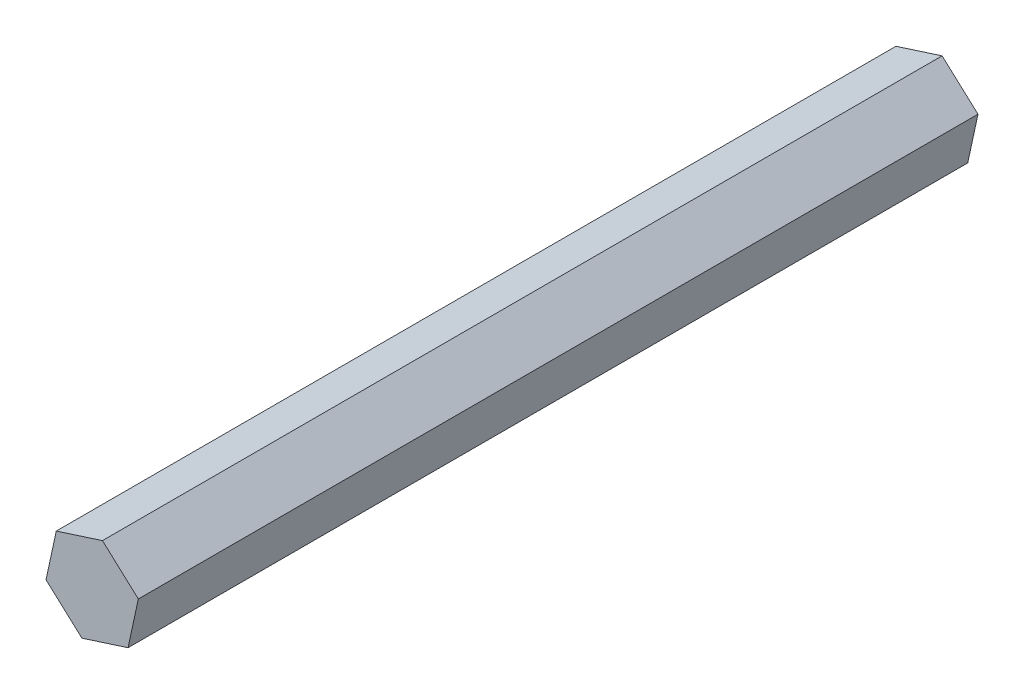
ISO-10303-21;
HEADER;
FILE_DESCRIPTION(('STEP AP214'),'2;1');
FILE_NAME('part.step','',(''),(''),'','','');
FILE_SCHEMA(('AUTOMOTIVE_DESIGN { 1 0 10303 214 1 1 1 1 }'));
ENDSEC;
DATA;
#1=APPLICATION_CONTEXT('core data for automotive mechanical design processes');
#2=APPLICATION_PROTOCOL_DEFINITION('international standard','automotive_design',2000,#1);
#3=PRODUCT_CONTEXT('',#1,'mechanical');
#4=PRODUCT('Part','Part','',(#3));
#5=PRODUCT_RELATED_PRODUCT_CATEGORY('part','',(#4));
#6=PRODUCT_DEFINITION_FORMATION('','',#4);
#7=PRODUCT_DEFINITION_CONTEXT('part definition',#1,'design');
#8=PRODUCT_DEFINITION('design','',#6,#7);
#9=PRODUCT_DEFINITION_SHAPE('','',#8);
#10=(LENGTH_UNIT() NAMED_UNIT(*) SI_UNIT(.MILLI.,.METRE.));
#11=(NAMED_UNIT(*) PLANE_ANGLE_UNIT() SI_UNIT($,.RADIAN.));
#12=(NAMED_UNIT(*) SI_UNIT($,.STERADIAN.) SOLID_ANGLE_UNIT());
#13=UNCERTAINTY_MEASURE_WITH_UNIT(LENGTH_MEASURE(1.E-05),#10,'distance_accuracy_value','');
#14=(GEOMETRIC_REPRESENTATION_CONTEXT(3) GLOBAL_UNCERTAINTY_ASSIGNED_CONTEXT((#13)) GLOBAL_UNIT_ASSIGNED_CONTEXT((#10,
#11,#12)) REPRESENTATION_CONTEXT('',''));
#15=CARTESIAN_POINT('',(0.,0.,0.));
#16=DIRECTION('',(0.,0.,1.));
#17=DIRECTION('',(1.,0.,0.));
#18=AXIS2_PLACEMENT_3D('',#15,#16,#17);
#19=CARTESIAN_POINT('',(-0.61182187926995,-2.82117126764399,50.));
#20=DIRECTION('',(-0.305094633460301,0.952322038300976,0.));
#21=DIRECTION('',(-0.952322038300976,-0.305094633460301,0.));
#22=AXIS2_PLACEMENT_3D('',#19,#20,#21);
#23=PLANE('',#22);
#24=DIRECTION('',(0.952322038300976,0.305094633460301,0.));
#25=VECTOR('',#24,1.);
#26=CARTESIAN_POINT('',(-0.61182187926995,-2.82117126764399,0.));
#27=LINE('',#26,#25);
#28=CARTESIAN_POINT('',(-0.61182187926995,-2.82117126764399,0.));
#29=VERTEX_POINT('',#28);
#30=CARTESIAN_POINT('',(2.13729504657146,-1.94043892386091,0.));
#31=VERTEX_POINT('',#30);
#32=EDGE_CURVE('E128',#29,#31,#27,.T.);
#33=ORIENTED_EDGE('',*,*,#32,.T.);
#34=DIRECTION('',(0.,0.,-1.));
#35=VECTOR('',#34,1.);
#36=CARTESIAN_POINT('',(2.13729504657146,-1.94043892386091,50.));
#37=LINE('',#36,#35);
#38=CARTESIAN_POINT('',(2.13729504657146,-1.94043892386091,50.));
#39=VERTEX_POINT('',#38);
#40=EDGE_CURVE('E11',#39,#31,#37,.T.);
#41=ORIENTED_EDGE('',*,*,#40,.F.);
#42=DIRECTION('',(0.952322038300976,0.305094633460301,0.));
#43=VECTOR('',#42,1.);
#44=CARTESIAN_POINT('',(-0.61182187926995,-2.82117126764399,50.));
#45=LINE('',#44,#43);
#46=CARTESIAN_POINT('',(-0.61182187926995,-2.82117126764399,50.));
#47=VERTEX_POINT('',#46);
#48=EDGE_CURVE('E144',#47,#39,#45,.T.);
#49=ORIENTED_EDGE('',*,*,#48,.F.);
#50=DIRECTION('',(0.,0.,-1.));
#51=VECTOR('',#50,1.);
#52=CARTESIAN_POINT('',(-0.61182187926995,-2.82117126764399,50.));
#53=LINE('',#52,#51);
#54=EDGE_CURVE('E124',#47,#29,#53,.T.);
#55=ORIENTED_EDGE('',*,*,#54,.T.);
#56=EDGE_LOOP('',(#33,#41,#49,#55));
#57=FACE_BOUND('',#56,.T.);
#58=ADVANCED_FACE('F39',(#57),#23,.F.);
#59=CARTESIAN_POINT('',(2.13729504657146,-1.94043892386091,50.));
#60=DIRECTION('',(-0.977282394482572,0.211941316015566,0.));
#61=DIRECTION('',(-0.211941316015566,-0.977282394482572,0.));
#62=AXIS2_PLACEMENT_3D('',#59,#60,#61);
#63=PLANE('',#62);
#64=DIRECTION('',(0.211941316015566,0.977282394482572,0.));
#65=VECTOR('',#64,1.);
#66=CARTESIAN_POINT('',(2.13729504657146,-1.94043892386091,0.));
#67=LINE('',#66,#65);
#68=CARTESIAN_POINT('',(2.74911692584142,0.880732343783076,0.));
#69=VERTEX_POINT('',#68);
#70=EDGE_CURVE('E132',#31,#69,#67,.T.);
#71=ORIENTED_EDGE('',*,*,#70,.T.);
#72=DIRECTION('',(0.,0.,-1.));
#73=VECTOR('',#72,1.);
#74=CARTESIAN_POINT('',(2.74911692584142,0.880732343783076,50.));
#75=LINE('',#74,#73);
#76=CARTESIAN_POINT('',(2.74911692584142,0.880732343783076,50.));
#77=VERTEX_POINT('',#76);
#78=EDGE_CURVE('E48',#77,#69,#75,.T.);
#79=ORIENTED_EDGE('',*,*,#78,.F.);
#80=DIRECTION('',(0.211941316015566,0.977282394482572,0.));
#81=VECTOR('',#80,1.);
#82=CARTESIAN_POINT('',(2.13729504657146,-1.94043892386091,50.));
#83=LINE('',#82,#81);
#84=EDGE_CURVE('E93',#39,#77,#83,.T.);
#85=ORIENTED_EDGE('',*,*,#84,.F.);
#86=ORIENTED_EDGE('',*,*,#40,.T.);
#87=EDGE_LOOP('',(#71,#79,#85,#86));
#88=FACE_BOUND('',#87,.T.);
#89=ADVANCED_FACE('F172',(#88),#63,.F.);
#90=CARTESIAN_POINT('',(2.74911692584142,0.880732343783076,50.));
#91=DIRECTION('',(-0.672187761022271,-0.74038072228541,0.));
#92=DIRECTION('',(0.74038072228541,-0.672187761022271,0.));
#93=AXIS2_PLACEMENT_3D('',#90,#91,#92);
#94=PLANE('',#93);
#95=DIRECTION('',(-0.74038072228541,0.672187761022271,0.));
#96=VECTOR('',#95,1.);
#97=CARTESIAN_POINT('',(2.74911692584142,0.880732343783076,0.));
#98=LINE('',#97,#96);
#99=CARTESIAN_POINT('',(0.611821879269952,2.82117126764399,0.));
#100=VERTEX_POINT('',#99);
#101=EDGE_CURVE('E135',#69,#100,#98,.T.);
#102=ORIENTED_EDGE('',*,*,#101,.T.);
#103=DIRECTION('',(0.,0.,-1.));
#104=VECTOR('',#103,1.);
#105=CARTESIAN_POINT('',(0.611821879269952,2.82117126764399,50.));
#106=LINE('',#105,#104);
#107=CARTESIAN_POINT('',(0.611821879269952,2.82117126764399,50.));
#108=VERTEX_POINT('',#107);
#109=EDGE_CURVE('E117',#108,#100,#106,.T.);
#110=ORIENTED_EDGE('',*,*,#109,.F.);
#111=DIRECTION('',(-0.74038072228541,0.672187761022271,0.));
#112=VECTOR('',#111,1.);
#113=CARTESIAN_POINT('',(2.74911692584142,0.880732343783076,50.));
#114=LINE('',#113,#112);
#115=EDGE_CURVE('E106',#77,#108,#114,.T.);
#116=ORIENTED_EDGE('',*,*,#115,.F.);
#117=ORIENTED_EDGE('',*,*,#78,.T.);
#118=EDGE_LOOP('',(#102,#110,#116,#117));
#119=FACE_BOUND('',#118,.T.);
#120=ADVANCED_FACE('F154',(#119),#94,.F.);
#121=CARTESIAN_POINT('',(0.611821879269952,2.82117126764399,50.));
#122=DIRECTION('',(0.305094633460301,-0.952322038300976,0.));
#123=DIRECTION('',(0.952322038300976,0.305094633460301,0.));
#124=AXIS2_PLACEMENT_3D('',#121,#122,#123);
#125=PLANE('',#124);
#126=DIRECTION('',(-0.952322038300976,-0.305094633460301,0.));
#127=VECTOR('',#126,1.);
#128=CARTESIAN_POINT('',(0.611821879269952,2.82117126764399,0.));
#129=LINE('',#128,#127);
#130=CARTESIAN_POINT('',(-2.13729504657146,1.94043892386091,0.));
#131=VERTEX_POINT('',#130);
#132=EDGE_CURVE('E115',#100,#131,#129,.T.);
#133=ORIENTED_EDGE('',*,*,#132,.T.);
#134=DIRECTION('',(0.,0.,-1.));
#135=VECTOR('',#134,1.);
#136=CARTESIAN_POINT('',(-2.13729504657146,1.94043892386091,50.));
#137=LINE('',#136,#135);
#138=CARTESIAN_POINT('',(-2.13729504657146,1.94043892386091,50.));
#139=VERTEX_POINT('',#138);
#140=EDGE_CURVE('E112',#139,#131,#137,.T.);
#141=ORIENTED_EDGE('',*,*,#140,.F.);
#142=DIRECTION('',(-0.952322038300976,-0.305094633460301,0.));
#143=VECTOR('',#142,1.);
#144=CARTESIAN_POINT('',(0.611821879269952,2.82117126764399,50.));
#145=LINE('',#144,#143);
#146=EDGE_CURVE('E100',#108,#139,#145,.T.);
#147=ORIENTED_EDGE('',*,*,#146,.F.);
#148=ORIENTED_EDGE('',*,*,#109,.T.);
#149=EDGE_LOOP('',(#133,#141,#147,#148));
#150=FACE_BOUND('',#149,.T.);
#151=ADVANCED_FACE('F113',(#150),#125,.F.);
#152=CARTESIAN_POINT('',(-2.13729504657146,1.94043892386091,50.));
#153=DIRECTION('',(0.977282394482573,-0.211941316015565,0.));
#154=DIRECTION('',(0.211941316015565,0.977282394482573,0.));
#155=AXIS2_PLACEMENT_3D('',#152,#153,#154);
#156=PLANE('',#155);
#157=DIRECTION('',(-0.211941316015565,-0.977282394482572,0.));
#158=VECTOR('',#157,1.);
#159=CARTESIAN_POINT('',(-2.13729504657146,1.94043892386091,0.));
#160=LINE('',#159,#158);
#161=CARTESIAN_POINT('',(-2.74911692584141,-0.88073234378308,0.));
#162=VERTEX_POINT('',#161);
#163=EDGE_CURVE('E79',#131,#162,#160,.T.);
#164=ORIENTED_EDGE('',*,*,#163,.T.);
#165=DIRECTION('',(0.,0.,-1.));
#166=VECTOR('',#165,1.);
#167=CARTESIAN_POINT('',(-2.74911692584141,-0.88073234378308,50.));
#168=LINE('',#167,#166);
#169=CARTESIAN_POINT('',(-2.74911692584141,-0.88073234378308,50.));
#170=VERTEX_POINT('',#169);
#171=EDGE_CURVE('E118',#170,#162,#168,.T.);
#172=ORIENTED_EDGE('',*,*,#171,.F.);
#173=DIRECTION('',(-0.211941316015565,-0.977282394482572,0.));
#174=VECTOR('',#173,1.);
#175=CARTESIAN_POINT('',(-2.13729504657146,1.94043892386091,50.));
#176=LINE('',#175,#174);
#177=EDGE_CURVE('E104',#139,#170,#176,.T.);
#178=ORIENTED_EDGE('',*,*,#177,.F.);
#179=ORIENTED_EDGE('',*,*,#140,.T.);
#180=EDGE_LOOP('',(#164,#172,#178,#179));
#181=FACE_BOUND('',#180,.T.);
#182=ADVANCED_FACE('F120',(#181),#156,.F.);
#183=CARTESIAN_POINT('',(-2.74911692584141,-0.88073234378308,50.));
#184=DIRECTION('',(0.672187761022271,0.740380722285411,0.));
#185=DIRECTION('',(-0.740380722285411,0.672187761022271,0.));
#186=AXIS2_PLACEMENT_3D('',#183,#184,#185);
#187=PLANE('',#186);
#188=DIRECTION('',(0.740380722285411,-0.672187761022271,0.));
#189=VECTOR('',#188,1.);
#190=CARTESIAN_POINT('',(-2.74911692584141,-0.88073234378308,0.));
#191=LINE('',#190,#189);
#192=EDGE_CURVE('E85',#162,#29,#191,.T.);
#193=ORIENTED_EDGE('',*,*,#192,.T.);
#194=ORIENTED_EDGE('',*,*,#54,.F.);
#195=DIRECTION('',(0.740380722285411,-0.672187761022271,0.));
#196=VECTOR('',#195,1.);
#197=CARTESIAN_POINT('',(-2.74911692584141,-0.88073234378308,50.));
#198=LINE('',#197,#196);
#199=EDGE_CURVE('E56',#170,#47,#198,.T.);
#200=ORIENTED_EDGE('',*,*,#199,.F.);
#201=ORIENTED_EDGE('',*,*,#171,.T.);
#202=EDGE_LOOP('',(#193,#194,#200,#201));
#203=FACE_BOUND('',#202,.T.);
#204=ADVANCED_FACE('F161',(#203),#187,.F.);
#205=CARTESIAN_POINT('',(0.,0.,50.));
#206=DIRECTION('',(0.,0.,1.));
#207=DIRECTION('',(1.,0.,0.));
#208=AXIS2_PLACEMENT_3D('',#205,#206,#207);
#209=PLANE('',#208);
#210=ORIENTED_EDGE('',*,*,#48,.T.);
#211=ORIENTED_EDGE('',*,*,#84,.T.);
#212=ORIENTED_EDGE('',*,*,#115,.T.);
#213=ORIENTED_EDGE('',*,*,#146,.T.);
#214=ORIENTED_EDGE('',*,*,#177,.T.);
#215=ORIENTED_EDGE('',*,*,#199,.T.);
#216=EDGE_LOOP('',(#210,#211,#212,#213,#214,#215));
#217=FACE_BOUND('',#216,.T.);
#218=ADVANCED_FACE('F102',(#217),#209,.T.);
#219=CARTESIAN_POINT('',(0.,0.,0.));
#220=DIRECTION('',(0.,0.,1.));
#221=DIRECTION('',(1.,0.,0.));
#222=AXIS2_PLACEMENT_3D('',#219,#220,#221);
#223=PLANE('',#222);
#224=ORIENTED_EDGE('',*,*,#32,.F.);
#225=ORIENTED_EDGE('',*,*,#192,.F.);
#226=ORIENTED_EDGE('',*,*,#163,.F.);
#227=ORIENTED_EDGE('',*,*,#132,.F.);
#228=ORIENTED_EDGE('',*,*,#101,.F.);
#229=ORIENTED_EDGE('',*,*,#70,.F.);
#230=EDGE_LOOP('',(#224,#225,#226,#227,#228,#229));
#231=FACE_BOUND('',#230,.T.);
#232=ADVANCED_FACE('F157',(#231),#223,.F.);
#233=CLOSED_SHELL('',(#58,#89,#120,#151,#182,#204,#218,#232));
#234=MANIFOLD_SOLID_BREP('B2',#233);
#235=ADVANCED_BREP_SHAPE_REPRESENTATION('',(#18,#234),#14);
#236=SHAPE_DEFINITION_REPRESENTATION(#9,#235);
ENDSEC;
END-ISO-10303-21;
